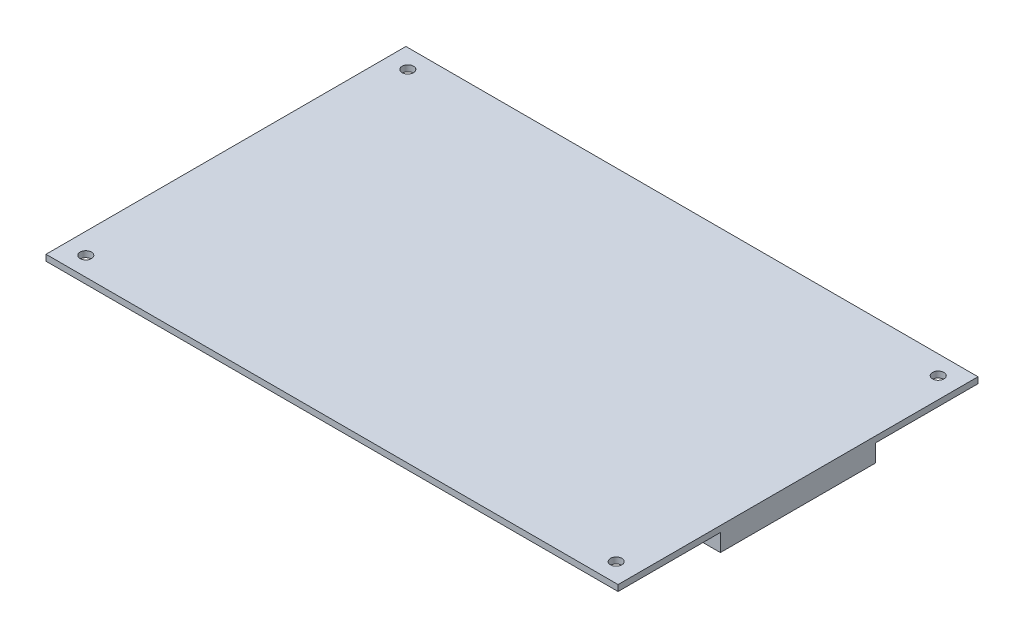
ISO-10303-21;
HEADER;
FILE_DESCRIPTION(('STEP AP214'),'2;1');
FILE_NAME('part.step','',(''),(''),'','','');
FILE_SCHEMA(('AUTOMOTIVE_DESIGN { 1 0 10303 214 1 1 1 1 }'));
ENDSEC;
DATA;
#1=APPLICATION_CONTEXT('core data for automotive mechanical design processes');
#2=APPLICATION_PROTOCOL_DEFINITION('international standard','automotive_design',2000,#1);
#3=PRODUCT_CONTEXT('',#1,'mechanical');
#4=PRODUCT('Part','Part','',(#3));
#5=PRODUCT_RELATED_PRODUCT_CATEGORY('part','',(#4));
#6=PRODUCT_DEFINITION_FORMATION('','',#4);
#7=PRODUCT_DEFINITION_CONTEXT('part definition',#1,'design');
#8=PRODUCT_DEFINITION('design','',#6,#7);
#9=PRODUCT_DEFINITION_SHAPE('','',#8);
#10=(LENGTH_UNIT() NAMED_UNIT(*) SI_UNIT(.MILLI.,.METRE.));
#11=(NAMED_UNIT(*) PLANE_ANGLE_UNIT() SI_UNIT($,.RADIAN.));
#12=(NAMED_UNIT(*) SI_UNIT($,.STERADIAN.) SOLID_ANGLE_UNIT());
#13=UNCERTAINTY_MEASURE_WITH_UNIT(LENGTH_MEASURE(1.E-05),#10,'distance_accuracy_value','');
#14=(GEOMETRIC_REPRESENTATION_CONTEXT(3) GLOBAL_UNCERTAINTY_ASSIGNED_CONTEXT((#13)) GLOBAL_UNIT_ASSIGNED_CONTEXT((#10,
#11,#12)) REPRESENTATION_CONTEXT('',''));
#15=CARTESIAN_POINT('',(0.,0.,0.));
#16=DIRECTION('',(0.,0.,1.));
#17=DIRECTION('',(1.,0.,0.));
#18=AXIS2_PLACEMENT_3D('',#15,#16,#17);
#19=CARTESIAN_POINT('',(0.,0.,0.));
#20=DIRECTION('',(0.,1.,0.));
#21=DIRECTION('',(0.,0.,1.));
#22=AXIS2_PLACEMENT_3D('',#19,#20,#21);
#23=PLANE('',#22);
#24=CARTESIAN_POINT('',(145.5,0.,90.));
#25=DIRECTION('',(0.,1.,0.));
#26=DIRECTION('',(0.,0.,1.));
#27=AXIS2_PLACEMENT_3D('',#24,#25,#26);
#28=CIRCLE('',#27,1.5);
#29=CARTESIAN_POINT('',(145.5,0.,91.5));
#30=VERTEX_POINT('',#29);
#31=EDGE_CURVE('E136',#30,#30,#28,.T.);
#32=ORIENTED_EDGE('',*,*,#31,.T.);
#33=EDGE_LOOP('',(#32));
#34=FACE_BOUND('',#33,.T.);
#35=CARTESIAN_POINT('',(5.49999999999998,0.,90.));
#36=DIRECTION('',(0.,1.,0.));
#37=DIRECTION('',(0.,0.,1.));
#38=AXIS2_PLACEMENT_3D('',#35,#36,#37);
#39=CIRCLE('',#38,1.5);
#40=CARTESIAN_POINT('',(5.49999999999998,0.,91.5));
#41=VERTEX_POINT('',#40);
#42=EDGE_CURVE('E140',#41,#41,#39,.T.);
#43=ORIENTED_EDGE('',*,*,#42,.T.);
#44=EDGE_LOOP('',(#43));
#45=FACE_BOUND('',#44,.T.);
#46=DIRECTION('',(-1.,0.,0.));
#47=VECTOR('',#46,1.);
#48=CARTESIAN_POINT('',(192.257241788564,0.,68.));
#49=LINE('',#48,#47);
#50=CARTESIAN_POINT('',(151.,0.,68.));
#51=VERTEX_POINT('',#50);
#52=CARTESIAN_POINT('',(0.,0.,68.));
#53=VERTEX_POINT('',#52);
#54=EDGE_CURVE('E65',#51,#53,#49,.T.);
#55=ORIENTED_EDGE('',*,*,#54,.F.);
#56=DIRECTION('',(0.,0.,-1.));
#57=VECTOR('',#56,1.);
#58=CARTESIAN_POINT('',(151.,0.,0.));
#59=LINE('',#58,#57);
#60=CARTESIAN_POINT('',(151.,0.,95.));
#61=VERTEX_POINT('',#60);
#62=EDGE_CURVE('E179',#61,#51,#59,.T.);
#63=ORIENTED_EDGE('',*,*,#62,.F.);
#64=DIRECTION('',(1.,0.,0.));
#65=VECTOR('',#64,1.);
#66=CARTESIAN_POINT('',(0.,0.,95.));
#67=LINE('',#66,#65);
#68=CARTESIAN_POINT('',(0.,0.,95.));
#69=VERTEX_POINT('',#68);
#70=EDGE_CURVE('E176',#69,#61,#67,.T.);
#71=ORIENTED_EDGE('',*,*,#70,.F.);
#72=DIRECTION('',(0.,0.,1.));
#73=VECTOR('',#72,1.);
#74=CARTESIAN_POINT('',(0.,0.,0.));
#75=LINE('',#74,#73);
#76=EDGE_CURVE('E158',#53,#69,#75,.T.);
#77=ORIENTED_EDGE('',*,*,#76,.F.);
#78=EDGE_LOOP('',(#55,#63,#71,#77));
#79=FACE_BOUND('',#78,.T.);
#80=ADVANCED_FACE('F39',(#34,#45,#79),#23,.F.);
#81=CARTESIAN_POINT('',(0.,1.6,0.));
#82=DIRECTION('',(1.,0.,0.));
#83=DIRECTION('',(0.,0.,-1.));
#84=AXIS2_PLACEMENT_3D('',#81,#82,#83);
#85=PLANE('',#84);
#86=CARTESIAN_POINT('',(0.,0.,0.));
#87=VERTEX_POINT('',#86);
#88=CARTESIAN_POINT('',(0.,0.,27.));
#89=VERTEX_POINT('',#88);
#90=EDGE_CURVE('E134',#87,#89,#75,.T.);
#91=ORIENTED_EDGE('',*,*,#90,.T.);
#92=DIRECTION('',(0.,-1.,0.));
#93=VECTOR('',#92,1.);
#94=CARTESIAN_POINT('',(0.,0.,27.));
#95=LINE('',#94,#93);
#96=CARTESIAN_POINT('',(0.,-4.6,27.));
#97=VERTEX_POINT('',#96);
#98=EDGE_CURVE('E114',#89,#97,#95,.T.);
#99=ORIENTED_EDGE('',*,*,#98,.T.);
#100=DIRECTION('',(0.,0.,1.));
#101=VECTOR('',#100,1.);
#102=CARTESIAN_POINT('',(0.,-4.6,27.));
#103=LINE('',#102,#101);
#104=CARTESIAN_POINT('',(0.,-4.59999999999999,68.));
#105=VERTEX_POINT('',#104);
#106=EDGE_CURVE('E123',#97,#105,#103,.T.);
#107=ORIENTED_EDGE('',*,*,#106,.T.);
#108=DIRECTION('',(0.,1.,0.));
#109=VECTOR('',#108,1.);
#110=CARTESIAN_POINT('',(0.,0.,68.));
#111=LINE('',#110,#109);
#112=EDGE_CURVE('E120',#105,#53,#111,.T.);
#113=ORIENTED_EDGE('',*,*,#112,.T.);
#114=ORIENTED_EDGE('',*,*,#76,.T.);
#115=DIRECTION('',(0.,-1.,0.));
#116=VECTOR('',#115,1.);
#117=CARTESIAN_POINT('',(0.,1.6,95.));
#118=LINE('',#117,#116);
#119=CARTESIAN_POINT('',(0.,1.6,95.));
#120=VERTEX_POINT('',#119);
#121=EDGE_CURVE('E11',#120,#69,#118,.T.);
#122=ORIENTED_EDGE('',*,*,#121,.F.);
#123=DIRECTION('',(0.,0.,1.));
#124=VECTOR('',#123,1.);
#125=CARTESIAN_POINT('',(0.,1.6,0.));
#126=LINE('',#125,#124);
#127=CARTESIAN_POINT('',(0.,1.6,0.));
#128=VERTEX_POINT('',#127);
#129=EDGE_CURVE('E159',#128,#120,#126,.T.);
#130=ORIENTED_EDGE('',*,*,#129,.F.);
#131=DIRECTION('',(0.,-1.,0.));
#132=VECTOR('',#131,1.);
#133=CARTESIAN_POINT('',(0.,1.6,0.));
#134=LINE('',#133,#132);
#135=EDGE_CURVE('E173',#128,#87,#134,.T.);
#136=ORIENTED_EDGE('',*,*,#135,.T.);
#137=EDGE_LOOP('',(#91,#99,#107,#113,#114,#122,#130,#136));
#138=FACE_BOUND('',#137,.T.);
#139=ADVANCED_FACE('F41',(#138),#85,.F.);
#140=CARTESIAN_POINT('',(0.,1.6,95.));
#141=DIRECTION('',(0.,0.,-1.));
#142=DIRECTION('',(-1.,0.,0.));
#143=AXIS2_PLACEMENT_3D('',#140,#141,#142);
#144=PLANE('',#143);
#145=ORIENTED_EDGE('',*,*,#70,.T.);
#146=DIRECTION('',(0.,-1.,0.));
#147=VECTOR('',#146,1.);
#148=CARTESIAN_POINT('',(151.,1.6,95.));
#149=LINE('',#148,#147);
#150=CARTESIAN_POINT('',(151.,1.6,95.));
#151=VERTEX_POINT('',#150);
#152=EDGE_CURVE('E49',#151,#61,#149,.T.);
#153=ORIENTED_EDGE('',*,*,#152,.F.);
#154=DIRECTION('',(1.,0.,0.));
#155=VECTOR('',#154,1.);
#156=CARTESIAN_POINT('',(0.,1.6,95.));
#157=LINE('',#156,#155);
#158=EDGE_CURVE('E163',#120,#151,#157,.T.);
#159=ORIENTED_EDGE('',*,*,#158,.F.);
#160=ORIENTED_EDGE('',*,*,#121,.T.);
#161=EDGE_LOOP('',(#145,#153,#159,#160));
#162=FACE_BOUND('',#161,.T.);
#163=ADVANCED_FACE('F235',(#162),#144,.F.);
#164=CARTESIAN_POINT('',(151.,1.6,0.));
#165=DIRECTION('',(-1.,0.,0.));
#166=DIRECTION('',(0.,0.,1.));
#167=AXIS2_PLACEMENT_3D('',#164,#165,#166);
#168=PLANE('',#167);
#169=ORIENTED_EDGE('',*,*,#62,.T.);
#170=DIRECTION('',(0.,-1.,0.));
#171=VECTOR('',#170,1.);
#172=CARTESIAN_POINT('',(151.,0.,68.));
#173=LINE('',#172,#171);
#174=CARTESIAN_POINT('',(151.,-4.59999999999999,68.));
#175=VERTEX_POINT('',#174);
#176=EDGE_CURVE('E150',#51,#175,#173,.T.);
#177=ORIENTED_EDGE('',*,*,#176,.T.);
#178=DIRECTION('',(0.,0.,-1.));
#179=VECTOR('',#178,1.);
#180=CARTESIAN_POINT('',(151.,-4.6,27.));
#181=LINE('',#180,#179);
#182=CARTESIAN_POINT('',(151.,-4.6,27.));
#183=VERTEX_POINT('',#182);
#184=EDGE_CURVE('E155',#175,#183,#181,.T.);
#185=ORIENTED_EDGE('',*,*,#184,.T.);
#186=DIRECTION('',(0.,1.,0.));
#187=VECTOR('',#186,1.);
#188=CARTESIAN_POINT('',(151.,0.,27.));
#189=LINE('',#188,#187);
#190=CARTESIAN_POINT('',(151.,0.,27.));
#191=VERTEX_POINT('',#190);
#192=EDGE_CURVE('E115',#183,#191,#189,.T.);
#193=ORIENTED_EDGE('',*,*,#192,.T.);
#194=CARTESIAN_POINT('',(151.,0.,0.));
#195=VERTEX_POINT('',#194);
#196=EDGE_CURVE('E57',#191,#195,#59,.T.);
#197=ORIENTED_EDGE('',*,*,#196,.T.);
#198=DIRECTION('',(0.,-1.,0.));
#199=VECTOR('',#198,1.);
#200=CARTESIAN_POINT('',(151.,1.6,0.));
#201=LINE('',#200,#199);
#202=CARTESIAN_POINT('',(151.,1.6,0.));
#203=VERTEX_POINT('',#202);
#204=EDGE_CURVE('E186',#203,#195,#201,.T.);
#205=ORIENTED_EDGE('',*,*,#204,.F.);
#206=DIRECTION('',(0.,0.,-1.));
#207=VECTOR('',#206,1.);
#208=CARTESIAN_POINT('',(151.,1.6,0.));
#209=LINE('',#208,#207);
#210=EDGE_CURVE('E167',#151,#203,#209,.T.);
#211=ORIENTED_EDGE('',*,*,#210,.F.);
#212=ORIENTED_EDGE('',*,*,#152,.T.);
#213=EDGE_LOOP('',(#169,#177,#185,#193,#197,#205,#211,#212));
#214=FACE_BOUND('',#213,.T.);
#215=ADVANCED_FACE('F220',(#214),#168,.F.);
#216=CARTESIAN_POINT('',(0.,1.6,0.));
#217=DIRECTION('',(0.,0.,1.));
#218=DIRECTION('',(1.,0.,0.));
#219=AXIS2_PLACEMENT_3D('',#216,#217,#218);
#220=PLANE('',#219);
#221=DIRECTION('',(-1.,0.,0.));
#222=VECTOR('',#221,1.);
#223=CARTESIAN_POINT('',(0.,0.,0.));
#224=LINE('',#223,#222);
#225=EDGE_CURVE('E164',#195,#87,#224,.T.);
#226=ORIENTED_EDGE('',*,*,#225,.T.);
#227=ORIENTED_EDGE('',*,*,#135,.F.);
#228=DIRECTION('',(-1.,0.,0.));
#229=VECTOR('',#228,1.);
#230=CARTESIAN_POINT('',(0.,1.6,0.));
#231=LINE('',#230,#229);
#232=EDGE_CURVE('E170',#203,#128,#231,.T.);
#233=ORIENTED_EDGE('',*,*,#232,.F.);
#234=ORIENTED_EDGE('',*,*,#204,.T.);
#235=EDGE_LOOP('',(#226,#227,#233,#234));
#236=FACE_BOUND('',#235,.T.);
#237=ADVANCED_FACE('F225',(#236),#220,.F.);
#238=CARTESIAN_POINT('',(0.,1.6,0.));
#239=DIRECTION('',(0.,1.,0.));
#240=DIRECTION('',(0.,0.,1.));
#241=AXIS2_PLACEMENT_3D('',#238,#239,#240);
#242=PLANE('',#241);
#243=CARTESIAN_POINT('',(145.5,1.6,4.99999999999998));
#244=DIRECTION('',(0.,1.,0.));
#245=DIRECTION('',(0.,0.,-1.));
#246=AXIS2_PLACEMENT_3D('',#243,#244,#245);
#247=CIRCLE('',#246,1.5);
#248=CARTESIAN_POINT('',(145.5,1.6,6.49999999999998));
#249=VERTEX_POINT('',#248);
#250=EDGE_CURVE('E212',#249,#249,#247,.T.);
#251=ORIENTED_EDGE('',*,*,#250,.F.);
#252=EDGE_LOOP('',(#251));
#253=FACE_BOUND('',#252,.T.);
#254=CARTESIAN_POINT('',(145.5,1.6,90.));
#255=DIRECTION('',(0.,1.,0.));
#256=DIRECTION('',(0.,0.,1.));
#257=AXIS2_PLACEMENT_3D('',#254,#255,#256);
#258=CIRCLE('',#257,1.5);
#259=CARTESIAN_POINT('',(145.5,1.6,91.5));
#260=VERTEX_POINT('',#259);
#261=EDGE_CURVE('E208',#260,#260,#258,.T.);
#262=ORIENTED_EDGE('',*,*,#261,.F.);
#263=EDGE_LOOP('',(#262));
#264=FACE_BOUND('',#263,.T.);
#265=CARTESIAN_POINT('',(5.49999999999998,1.6,90.));
#266=DIRECTION('',(0.,1.,0.));
#267=DIRECTION('',(0.,0.,-1.));
#268=AXIS2_PLACEMENT_3D('',#265,#266,#267);
#269=CIRCLE('',#268,1.5);
#270=CARTESIAN_POINT('',(5.49999999999998,1.6,91.5));
#271=VERTEX_POINT('',#270);
#272=EDGE_CURVE('E202',#271,#271,#269,.T.);
#273=ORIENTED_EDGE('',*,*,#272,.F.);
#274=EDGE_LOOP('',(#273));
#275=FACE_BOUND('',#274,.T.);
#276=CARTESIAN_POINT('',(5.49999999999997,1.6,5.));
#277=DIRECTION('',(0.,1.,0.));
#278=DIRECTION('',(0.,0.,1.));
#279=AXIS2_PLACEMENT_3D('',#276,#277,#278);
#280=CIRCLE('',#279,1.5);
#281=CARTESIAN_POINT('',(5.49999999999997,1.6,6.5));
#282=VERTEX_POINT('',#281);
#283=EDGE_CURVE('E195',#282,#282,#280,.T.);
#284=ORIENTED_EDGE('',*,*,#283,.F.);
#285=EDGE_LOOP('',(#284));
#286=FACE_BOUND('',#285,.T.);
#287=ORIENTED_EDGE('',*,*,#129,.T.);
#288=ORIENTED_EDGE('',*,*,#158,.T.);
#289=ORIENTED_EDGE('',*,*,#210,.T.);
#290=ORIENTED_EDGE('',*,*,#232,.T.);
#291=EDGE_LOOP('',(#287,#288,#289,#290));
#292=FACE_BOUND('',#291,.T.);
#293=ADVANCED_FACE('F230',(#253,#264,#275,#286,#292),#242,.T.);
#294=CARTESIAN_POINT('',(145.5,0.,4.99999999999998));
#295=DIRECTION('',(0.,1.,0.));
#296=DIRECTION('',(0.,0.,1.));
#297=AXIS2_PLACEMENT_3D('',#294,#295,#296);
#298=CIRCLE('',#297,1.5);
#299=CARTESIAN_POINT('',(145.5,0.,6.49999999999998));
#300=VERTEX_POINT('',#299);
#301=EDGE_CURVE('E43',#300,#300,#298,.T.);
#302=ORIENTED_EDGE('',*,*,#301,.T.);
#303=EDGE_LOOP('',(#302));
#304=FACE_BOUND('',#303,.T.);
#305=CARTESIAN_POINT('',(5.49999999999997,0.,5.));
#306=DIRECTION('',(0.,1.,0.));
#307=DIRECTION('',(0.,0.,1.));
#308=AXIS2_PLACEMENT_3D('',#305,#306,#307);
#309=CIRCLE('',#308,1.5);
#310=CARTESIAN_POINT('',(5.49999999999997,0.,6.5));
#311=VERTEX_POINT('',#310);
#312=EDGE_CURVE('E192',#311,#311,#309,.T.);
#313=ORIENTED_EDGE('',*,*,#312,.T.);
#314=EDGE_LOOP('',(#313));
#315=FACE_BOUND('',#314,.T.);
#316=ORIENTED_EDGE('',*,*,#196,.F.);
#317=DIRECTION('',(-1.,0.,0.));
#318=VECTOR('',#317,1.);
#319=CARTESIAN_POINT('',(192.257241788564,0.,27.));
#320=LINE('',#319,#318);
#321=EDGE_CURVE('E147',#191,#89,#320,.T.);
#322=ORIENTED_EDGE('',*,*,#321,.T.);
#323=ORIENTED_EDGE('',*,*,#90,.F.);
#324=ORIENTED_EDGE('',*,*,#225,.F.);
#325=EDGE_LOOP('',(#316,#322,#323,#324));
#326=FACE_BOUND('',#325,.T.);
#327=ADVANCED_FACE('F222',(#304,#315,#326),#23,.F.);
#328=CARTESIAN_POINT('',(192.257241788564,0.,27.));
#329=DIRECTION('',(0.,0.,-1.));
#330=DIRECTION('',(-1.,0.,0.));
#331=AXIS2_PLACEMENT_3D('',#328,#329,#330);
#332=PLANE('',#331);
#333=ORIENTED_EDGE('',*,*,#192,.F.);
#334=DIRECTION('',(-1.,0.,0.));
#335=VECTOR('',#334,1.);
#336=CARTESIAN_POINT('',(192.257241788564,-4.6,27.));
#337=LINE('',#336,#335);
#338=EDGE_CURVE('E109',#183,#97,#337,.T.);
#339=ORIENTED_EDGE('',*,*,#338,.T.);
#340=ORIENTED_EDGE('',*,*,#98,.F.);
#341=ORIENTED_EDGE('',*,*,#321,.F.);
#342=EDGE_LOOP('',(#333,#339,#340,#341));
#343=FACE_BOUND('',#342,.T.);
#344=ADVANCED_FACE('F111',(#343),#332,.T.);
#345=CARTESIAN_POINT('',(192.257241788564,0.,68.));
#346=DIRECTION('',(0.,0.,1.));
#347=DIRECTION('',(0.,-1.,0.));
#348=AXIS2_PLACEMENT_3D('',#345,#346,#347);
#349=PLANE('',#348);
#350=ORIENTED_EDGE('',*,*,#176,.F.);
#351=ORIENTED_EDGE('',*,*,#54,.T.);
#352=ORIENTED_EDGE('',*,*,#112,.F.);
#353=DIRECTION('',(-1.,0.,0.));
#354=VECTOR('',#353,1.);
#355=CARTESIAN_POINT('',(192.257241788564,-4.59999999999999,68.));
#356=LINE('',#355,#354);
#357=EDGE_CURVE('E119',#175,#105,#356,.T.);
#358=ORIENTED_EDGE('',*,*,#357,.F.);
#359=EDGE_LOOP('',(#350,#351,#352,#358));
#360=FACE_BOUND('',#359,.T.);
#361=ADVANCED_FACE('F256',(#360),#349,.T.);
#362=CARTESIAN_POINT('',(192.257241788564,-4.6,27.));
#363=DIRECTION('',(0.,-1.,0.));
#364=DIRECTION('',(0.,0.,-1.));
#365=AXIS2_PLACEMENT_3D('',#362,#363,#364);
#366=PLANE('',#365);
#367=ORIENTED_EDGE('',*,*,#184,.F.);
#368=ORIENTED_EDGE('',*,*,#357,.T.);
#369=ORIENTED_EDGE('',*,*,#106,.F.);
#370=ORIENTED_EDGE('',*,*,#338,.F.);
#371=EDGE_LOOP('',(#367,#368,#369,#370));
#372=FACE_BOUND('',#371,.T.);
#373=ADVANCED_FACE('F124',(#372),#366,.T.);
#374=CARTESIAN_POINT('',(5.49999999999997,-4.6,5.));
#375=DIRECTION('',(0.,1.,0.));
#376=DIRECTION('',(0.,0.,1.));
#377=AXIS2_PLACEMENT_3D('',#374,#375,#376);
#378=CYLINDRICAL_SURFACE('',#377,1.5);
#379=CARTESIAN_POINT('',(5.49999999999997,1.6,6.5));
#380=CARTESIAN_POINT('',(5.49999999999997,1.58333333333333,6.5));
#381=CARTESIAN_POINT('',(5.49999999999997,1.56666666666667,6.5));
#382=CARTESIAN_POINT('',(5.49999999999997,1.53333333333333,6.5));
#383=CARTESIAN_POINT('',(5.49999999999997,1.51666666666667,6.5));
#384=CARTESIAN_POINT('',(5.49999999999997,1.48333333333333,6.5));
#385=CARTESIAN_POINT('',(5.49999999999997,1.46666666666667,6.5));
#386=CARTESIAN_POINT('',(5.49999999999997,1.43333333333333,6.5));
#387=CARTESIAN_POINT('',(5.49999999999997,1.41666666666667,6.5));
#388=CARTESIAN_POINT('',(5.49999999999997,1.38333333333333,6.5));
#389=CARTESIAN_POINT('',(5.49999999999997,1.36666666666667,6.5));
#390=CARTESIAN_POINT('',(5.49999999999997,1.33333333333333,6.5));
#391=CARTESIAN_POINT('',(5.49999999999997,1.31666666666667,6.5));
#392=CARTESIAN_POINT('',(5.49999999999997,1.28333333333333,6.5));
#393=CARTESIAN_POINT('',(5.49999999999997,1.26666666666667,6.5));
#394=CARTESIAN_POINT('',(5.49999999999997,1.23333333333333,6.5));
#395=CARTESIAN_POINT('',(5.49999999999997,1.21666666666667,6.5));
#396=CARTESIAN_POINT('',(5.49999999999997,1.18333333333333,6.5));
#397=CARTESIAN_POINT('',(5.49999999999997,1.16666666666667,6.5));
#398=CARTESIAN_POINT('',(5.49999999999997,1.13333333333333,6.5));
#399=CARTESIAN_POINT('',(5.49999999999997,1.11666666666667,6.5));
#400=CARTESIAN_POINT('',(5.49999999999997,1.08333333333333,6.5));
#401=CARTESIAN_POINT('',(5.49999999999997,1.06666666666667,6.5));
#402=CARTESIAN_POINT('',(5.49999999999997,1.03333333333333,6.5));
#403=CARTESIAN_POINT('',(5.49999999999997,1.01666666666667,6.5));
#404=CARTESIAN_POINT('',(5.49999999999997,0.983333333333333,6.5));
#405=CARTESIAN_POINT('',(5.49999999999997,0.966666666666666,6.5));
#406=CARTESIAN_POINT('',(5.49999999999997,0.933333333333333,6.5));
#407=CARTESIAN_POINT('',(5.49999999999997,0.916666666666666,6.5));
#408=CARTESIAN_POINT('',(5.49999999999997,0.883333333333333,6.5));
#409=CARTESIAN_POINT('',(5.49999999999997,0.866666666666666,6.5));
#410=CARTESIAN_POINT('',(5.49999999999997,0.833333333333333,6.5));
#411=CARTESIAN_POINT('',(5.49999999999997,0.816666666666666,6.5));
#412=CARTESIAN_POINT('',(5.49999999999997,0.783333333333333,6.5));
#413=CARTESIAN_POINT('',(5.49999999999997,0.766666666666666,6.5));
#414=CARTESIAN_POINT('',(5.49999999999997,0.733333333333333,6.5));
#415=CARTESIAN_POINT('',(5.49999999999997,0.716666666666666,6.5));
#416=CARTESIAN_POINT('',(5.49999999999997,0.683333333333333,6.5));
#417=CARTESIAN_POINT('',(5.49999999999997,0.666666666666666,6.5));
#418=CARTESIAN_POINT('',(5.49999999999997,0.633333333333333,6.5));
#419=CARTESIAN_POINT('',(5.49999999999997,0.616666666666666,6.5));
#420=CARTESIAN_POINT('',(5.49999999999997,0.583333333333332,6.5));
#421=CARTESIAN_POINT('',(5.49999999999997,0.566666666666666,6.5));
#422=CARTESIAN_POINT('',(5.49999999999997,0.533333333333333,6.5));
#423=CARTESIAN_POINT('',(5.49999999999997,0.516666666666666,6.5));
#424=CARTESIAN_POINT('',(5.49999999999997,0.483333333333333,6.5));
#425=CARTESIAN_POINT('',(5.49999999999997,0.466666666666666,6.5));
#426=CARTESIAN_POINT('',(5.49999999999997,0.433333333333333,6.5));
#427=CARTESIAN_POINT('',(5.49999999999997,0.416666666666666,6.5));
#428=CARTESIAN_POINT('',(5.49999999999997,0.383333333333332,6.5));
#429=CARTESIAN_POINT('',(5.49999999999997,0.366666666666666,6.5));
#430=CARTESIAN_POINT('',(5.49999999999997,0.333333333333332,6.5));
#431=CARTESIAN_POINT('',(5.49999999999997,0.316666666666666,6.5));
#432=CARTESIAN_POINT('',(5.49999999999997,0.283333333333332,6.5));
#433=CARTESIAN_POINT('',(5.49999999999997,0.266666666666666,6.5));
#434=CARTESIAN_POINT('',(5.49999999999997,0.233333333333333,6.5));
#435=CARTESIAN_POINT('',(5.49999999999997,0.216666666666666,6.5));
#436=CARTESIAN_POINT('',(5.49999999999997,0.183333333333333,6.5));
#437=CARTESIAN_POINT('',(5.49999999999997,0.166666666666666,6.5));
#438=CARTESIAN_POINT('',(5.49999999999997,0.133333333333333,6.5));
#439=CARTESIAN_POINT('',(5.49999999999997,0.116666666666666,6.5));
#440=CARTESIAN_POINT('',(5.49999999999997,0.0833333333333325,6.5));
#441=CARTESIAN_POINT('',(5.49999999999997,0.0666666666666657,6.5));
#442=CARTESIAN_POINT('',(5.49999999999997,0.0333333333333323,6.5));
#443=CARTESIAN_POINT('',(5.49999999999997,0.0166666666666657,6.5));
#444=CARTESIAN_POINT('',(5.49999999999997,0.,6.5));
#445=B_SPLINE_CURVE_WITH_KNOTS('',3,(#379,#380,#381,#382,#383,#384,#385,#386,#387,#388,#389,
#390,#391,#392,#393,#394,#395,#396,#397,#398,#399,#400,#401,#402,#403,#404,#405,#406,#407,#408,
#409,#410,#411,#412,#413,#414,#415,#416,#417,#418,#419,#420,#421,#422,#423,#424,#425,#426,#427,
#428,#429,#430,#431,#432,#433,#434,#435,#436,#437,#438,#439,#440,#441,#442,#443,#444),
.UNSPECIFIED.,.F.,.F.,(4,2,2,2,2,2,2,2,2,2,2,2,2,2,2,2,2,2,2,2,2,2,2,2,2,2,2,2,2,2,2,2,4),(0.,
0.0499999999999997,0.1,0.15,0.200000000000001,0.25,0.3,0.35,0.4,0.45,0.5,0.55,0.6,0.65,0.7,
0.750000000000001,0.8,0.85,0.900000000000001,0.95,1.,1.05,1.1,1.15,1.2,1.25,1.3,1.35,1.4,1.45,
1.5,1.55,1.6),.UNSPECIFIED.);
#446=EDGE_CURVE('BSEAM264',#282,#311,#445,.T.);
#447=ORIENTED_EDGE('',*,*,#283,.T.);
#448=ORIENTED_EDGE('',*,*,#312,.F.);
#449=ORIENTED_EDGE('',*,*,#446,.T.);
#450=ORIENTED_EDGE('',*,*,#446,.F.);
#451=EDGE_LOOP('',(#447,#449,#448,#450));
#452=FACE_BOUND('',#451,.T.);
#453=ADVANCED_FACE('F264',(#452),#378,.F.);
#454=CARTESIAN_POINT('',(145.5,-4.6,4.99999999999998));
#455=DIRECTION('',(0.,1.,0.));
#456=DIRECTION('',(0.,0.,1.));
#457=AXIS2_PLACEMENT_3D('',#454,#455,#456);
#458=CYLINDRICAL_SURFACE('',#457,1.5);
#459=CARTESIAN_POINT('',(145.5,1.6,6.49999999999998));
#460=CARTESIAN_POINT('',(145.5,1.58333333333333,6.49999999999998));
#461=CARTESIAN_POINT('',(145.5,1.56666666666667,6.49999999999998));
#462=CARTESIAN_POINT('',(145.5,1.53333333333333,6.49999999999998));
#463=CARTESIAN_POINT('',(145.5,1.51666666666667,6.49999999999998));
#464=CARTESIAN_POINT('',(145.5,1.48333333333333,6.49999999999998));
#465=CARTESIAN_POINT('',(145.5,1.46666666666667,6.49999999999998));
#466=CARTESIAN_POINT('',(145.5,1.43333333333333,6.49999999999998));
#467=CARTESIAN_POINT('',(145.5,1.41666666666667,6.49999999999998));
#468=CARTESIAN_POINT('',(145.5,1.38333333333333,6.49999999999998));
#469=CARTESIAN_POINT('',(145.5,1.36666666666667,6.49999999999998));
#470=CARTESIAN_POINT('',(145.5,1.33333333333333,6.49999999999998));
#471=CARTESIAN_POINT('',(145.5,1.31666666666667,6.49999999999998));
#472=CARTESIAN_POINT('',(145.5,1.28333333333333,6.49999999999998));
#473=CARTESIAN_POINT('',(145.5,1.26666666666667,6.49999999999998));
#474=CARTESIAN_POINT('',(145.5,1.23333333333333,6.49999999999998));
#475=CARTESIAN_POINT('',(145.5,1.21666666666667,6.49999999999998));
#476=CARTESIAN_POINT('',(145.5,1.18333333333333,6.49999999999998));
#477=CARTESIAN_POINT('',(145.5,1.16666666666667,6.49999999999998));
#478=CARTESIAN_POINT('',(145.5,1.13333333333333,6.49999999999998));
#479=CARTESIAN_POINT('',(145.5,1.11666666666667,6.49999999999998));
#480=CARTESIAN_POINT('',(145.5,1.08333333333333,6.49999999999998));
#481=CARTESIAN_POINT('',(145.5,1.06666666666667,6.49999999999998));
#482=CARTESIAN_POINT('',(145.5,1.03333333333333,6.49999999999998));
#483=CARTESIAN_POINT('',(145.5,1.01666666666667,6.49999999999998));
#484=CARTESIAN_POINT('',(145.5,0.983333333333333,6.49999999999998));
#485=CARTESIAN_POINT('',(145.5,0.966666666666666,6.49999999999998));
#486=CARTESIAN_POINT('',(145.5,0.933333333333333,6.49999999999998));
#487=CARTESIAN_POINT('',(145.5,0.916666666666666,6.49999999999998));
#488=CARTESIAN_POINT('',(145.5,0.883333333333333,6.49999999999998));
#489=CARTESIAN_POINT('',(145.5,0.866666666666666,6.49999999999998));
#490=CARTESIAN_POINT('',(145.5,0.833333333333333,6.49999999999998));
#491=CARTESIAN_POINT('',(145.5,0.816666666666666,6.49999999999998));
#492=CARTESIAN_POINT('',(145.5,0.783333333333333,6.49999999999998));
#493=CARTESIAN_POINT('',(145.5,0.766666666666666,6.49999999999998));
#494=CARTESIAN_POINT('',(145.5,0.733333333333333,6.49999999999998));
#495=CARTESIAN_POINT('',(145.5,0.716666666666666,6.49999999999998));
#496=CARTESIAN_POINT('',(145.5,0.683333333333333,6.49999999999998));
#497=CARTESIAN_POINT('',(145.5,0.666666666666666,6.49999999999998));
#498=CARTESIAN_POINT('',(145.5,0.633333333333333,6.49999999999998));
#499=CARTESIAN_POINT('',(145.5,0.616666666666666,6.49999999999998));
#500=CARTESIAN_POINT('',(145.5,0.583333333333332,6.49999999999998));
#501=CARTESIAN_POINT('',(145.5,0.566666666666666,6.49999999999998));
#502=CARTESIAN_POINT('',(145.5,0.533333333333333,6.49999999999998));
#503=CARTESIAN_POINT('',(145.5,0.516666666666666,6.49999999999998));
#504=CARTESIAN_POINT('',(145.5,0.483333333333333,6.49999999999998));
#505=CARTESIAN_POINT('',(145.5,0.466666666666666,6.49999999999998));
#506=CARTESIAN_POINT('',(145.5,0.433333333333333,6.49999999999998));
#507=CARTESIAN_POINT('',(145.5,0.416666666666666,6.49999999999998));
#508=CARTESIAN_POINT('',(145.5,0.383333333333332,6.49999999999998));
#509=CARTESIAN_POINT('',(145.5,0.366666666666666,6.49999999999998));
#510=CARTESIAN_POINT('',(145.5,0.333333333333332,6.49999999999998));
#511=CARTESIAN_POINT('',(145.5,0.316666666666666,6.49999999999998));
#512=CARTESIAN_POINT('',(145.5,0.283333333333332,6.49999999999998));
#513=CARTESIAN_POINT('',(145.5,0.266666666666666,6.49999999999998));
#514=CARTESIAN_POINT('',(145.5,0.233333333333333,6.49999999999998));
#515=CARTESIAN_POINT('',(145.5,0.216666666666666,6.49999999999998));
#516=CARTESIAN_POINT('',(145.5,0.183333333333333,6.49999999999998));
#517=CARTESIAN_POINT('',(145.5,0.166666666666666,6.49999999999998));
#518=CARTESIAN_POINT('',(145.5,0.133333333333333,6.49999999999998));
#519=CARTESIAN_POINT('',(145.5,0.116666666666666,6.49999999999998));
#520=CARTESIAN_POINT('',(145.5,0.0833333333333325,6.49999999999998));
#521=CARTESIAN_POINT('',(145.5,0.0666666666666657,6.49999999999998));
#522=CARTESIAN_POINT('',(145.5,0.0333333333333323,6.49999999999998));
#523=CARTESIAN_POINT('',(145.5,0.0166666666666657,6.49999999999998));
#524=CARTESIAN_POINT('',(145.5,0.,6.49999999999998));
#525=B_SPLINE_CURVE_WITH_KNOTS('',3,(#459,#460,#461,#462,#463,#464,#465,#466,#467,#468,#469,
#470,#471,#472,#473,#474,#475,#476,#477,#478,#479,#480,#481,#482,#483,#484,#485,#486,#487,#488,
#489,#490,#491,#492,#493,#494,#495,#496,#497,#498,#499,#500,#501,#502,#503,#504,#505,#506,#507,
#508,#509,#510,#511,#512,#513,#514,#515,#516,#517,#518,#519,#520,#521,#522,#523,#524),
.UNSPECIFIED.,.F.,.F.,(4,2,2,2,2,2,2,2,2,2,2,2,2,2,2,2,2,2,2,2,2,2,2,2,2,2,2,2,2,2,2,2,4),(0.,
0.0499999999999997,0.1,0.15,0.200000000000001,0.25,0.3,0.35,0.4,0.45,0.5,0.55,0.6,0.65,0.7,
0.750000000000001,0.8,0.85,0.900000000000001,0.95,1.,1.05,1.1,1.15,1.2,1.25,1.3,1.35,1.4,1.45,
1.5,1.55,1.6),.UNSPECIFIED.);
#526=EDGE_CURVE('BSEAM261',#249,#300,#525,.T.);
#527=ORIENTED_EDGE('',*,*,#250,.T.);
#528=ORIENTED_EDGE('',*,*,#301,.F.);
#529=ORIENTED_EDGE('',*,*,#526,.T.);
#530=ORIENTED_EDGE('',*,*,#526,.F.);
#531=EDGE_LOOP('',(#527,#529,#528,#530));
#532=FACE_BOUND('',#531,.T.);
#533=ADVANCED_FACE('F261',(#532),#458,.F.);
#534=CARTESIAN_POINT('',(5.49999999999998,-4.6,90.));
#535=DIRECTION('',(0.,1.,0.));
#536=DIRECTION('',(0.,0.,1.));
#537=AXIS2_PLACEMENT_3D('',#534,#535,#536);
#538=CYLINDRICAL_SURFACE('',#537,1.5);
#539=CARTESIAN_POINT('',(5.49999999999998,1.6,91.5));
#540=CARTESIAN_POINT('',(5.49999999999998,1.58333333333333,91.5));
#541=CARTESIAN_POINT('',(5.49999999999998,1.56666666666667,91.5));
#542=CARTESIAN_POINT('',(5.49999999999998,1.53333333333333,91.5));
#543=CARTESIAN_POINT('',(5.49999999999998,1.51666666666667,91.5));
#544=CARTESIAN_POINT('',(5.49999999999998,1.48333333333333,91.5));
#545=CARTESIAN_POINT('',(5.49999999999998,1.46666666666667,91.5));
#546=CARTESIAN_POINT('',(5.49999999999998,1.43333333333333,91.5));
#547=CARTESIAN_POINT('',(5.49999999999998,1.41666666666667,91.5));
#548=CARTESIAN_POINT('',(5.49999999999998,1.38333333333333,91.5));
#549=CARTESIAN_POINT('',(5.49999999999998,1.36666666666667,91.5));
#550=CARTESIAN_POINT('',(5.49999999999998,1.33333333333333,91.5));
#551=CARTESIAN_POINT('',(5.49999999999998,1.31666666666667,91.5));
#552=CARTESIAN_POINT('',(5.49999999999998,1.28333333333333,91.5));
#553=CARTESIAN_POINT('',(5.49999999999998,1.26666666666667,91.5));
#554=CARTESIAN_POINT('',(5.49999999999998,1.23333333333333,91.5));
#555=CARTESIAN_POINT('',(5.49999999999998,1.21666666666667,91.5));
#556=CARTESIAN_POINT('',(5.49999999999998,1.18333333333333,91.5));
#557=CARTESIAN_POINT('',(5.49999999999998,1.16666666666667,91.5));
#558=CARTESIAN_POINT('',(5.49999999999998,1.13333333333333,91.5));
#559=CARTESIAN_POINT('',(5.49999999999998,1.11666666666667,91.5));
#560=CARTESIAN_POINT('',(5.49999999999998,1.08333333333333,91.5));
#561=CARTESIAN_POINT('',(5.49999999999998,1.06666666666667,91.5));
#562=CARTESIAN_POINT('',(5.49999999999998,1.03333333333333,91.5));
#563=CARTESIAN_POINT('',(5.49999999999998,1.01666666666667,91.5));
#564=CARTESIAN_POINT('',(5.49999999999998,0.983333333333333,91.5));
#565=CARTESIAN_POINT('',(5.49999999999998,0.966666666666666,91.5));
#566=CARTESIAN_POINT('',(5.49999999999998,0.933333333333333,91.5));
#567=CARTESIAN_POINT('',(5.49999999999998,0.916666666666666,91.5));
#568=CARTESIAN_POINT('',(5.49999999999998,0.883333333333333,91.5));
#569=CARTESIAN_POINT('',(5.49999999999998,0.866666666666666,91.5));
#570=CARTESIAN_POINT('',(5.49999999999998,0.833333333333333,91.5));
#571=CARTESIAN_POINT('',(5.49999999999998,0.816666666666666,91.5));
#572=CARTESIAN_POINT('',(5.49999999999998,0.783333333333333,91.5));
#573=CARTESIAN_POINT('',(5.49999999999998,0.766666666666666,91.5));
#574=CARTESIAN_POINT('',(5.49999999999998,0.733333333333333,91.5));
#575=CARTESIAN_POINT('',(5.49999999999998,0.716666666666666,91.5));
#576=CARTESIAN_POINT('',(5.49999999999998,0.683333333333333,91.5));
#577=CARTESIAN_POINT('',(5.49999999999998,0.666666666666666,91.5));
#578=CARTESIAN_POINT('',(5.49999999999998,0.633333333333333,91.5));
#579=CARTESIAN_POINT('',(5.49999999999998,0.616666666666666,91.5));
#580=CARTESIAN_POINT('',(5.49999999999998,0.583333333333332,91.5));
#581=CARTESIAN_POINT('',(5.49999999999998,0.566666666666666,91.5));
#582=CARTESIAN_POINT('',(5.49999999999998,0.533333333333333,91.5));
#583=CARTESIAN_POINT('',(5.49999999999998,0.516666666666666,91.5));
#584=CARTESIAN_POINT('',(5.49999999999998,0.483333333333333,91.5));
#585=CARTESIAN_POINT('',(5.49999999999998,0.466666666666666,91.5));
#586=CARTESIAN_POINT('',(5.49999999999998,0.433333333333333,91.5));
#587=CARTESIAN_POINT('',(5.49999999999998,0.416666666666666,91.5));
#588=CARTESIAN_POINT('',(5.49999999999998,0.383333333333332,91.5));
#589=CARTESIAN_POINT('',(5.49999999999998,0.366666666666666,91.5));
#590=CARTESIAN_POINT('',(5.49999999999998,0.333333333333332,91.5));
#591=CARTESIAN_POINT('',(5.49999999999998,0.316666666666666,91.5));
#592=CARTESIAN_POINT('',(5.49999999999998,0.283333333333332,91.5));
#593=CARTESIAN_POINT('',(5.49999999999998,0.266666666666666,91.5));
#594=CARTESIAN_POINT('',(5.49999999999998,0.233333333333333,91.5));
#595=CARTESIAN_POINT('',(5.49999999999998,0.216666666666666,91.5));
#596=CARTESIAN_POINT('',(5.49999999999998,0.183333333333333,91.5));
#597=CARTESIAN_POINT('',(5.49999999999998,0.166666666666666,91.5));
#598=CARTESIAN_POINT('',(5.49999999999998,0.133333333333333,91.5));
#599=CARTESIAN_POINT('',(5.49999999999998,0.116666666666666,91.5));
#600=CARTESIAN_POINT('',(5.49999999999998,0.0833333333333325,91.5));
#601=CARTESIAN_POINT('',(5.49999999999998,0.0666666666666657,91.5));
#602=CARTESIAN_POINT('',(5.49999999999998,0.0333333333333323,91.5));
#603=CARTESIAN_POINT('',(5.49999999999998,0.0166666666666657,91.5));
#604=CARTESIAN_POINT('',(5.49999999999998,0.,91.5));
#605=B_SPLINE_CURVE_WITH_KNOTS('',3,(#539,#540,#541,#542,#543,#544,#545,#546,#547,#548,#549,
#550,#551,#552,#553,#554,#555,#556,#557,#558,#559,#560,#561,#562,#563,#564,#565,#566,#567,#568,
#569,#570,#571,#572,#573,#574,#575,#576,#577,#578,#579,#580,#581,#582,#583,#584,#585,#586,#587,
#588,#589,#590,#591,#592,#593,#594,#595,#596,#597,#598,#599,#600,#601,#602,#603,#604),
.UNSPECIFIED.,.F.,.F.,(4,2,2,2,2,2,2,2,2,2,2,2,2,2,2,2,2,2,2,2,2,2,2,2,2,2,2,2,2,2,2,2,4),(0.,
0.0499999999999997,0.1,0.15,0.200000000000001,0.25,0.3,0.35,0.4,0.45,0.5,0.55,0.6,0.65,0.7,
0.750000000000001,0.8,0.85,0.900000000000001,0.95,1.,1.05,1.1,1.15,1.2,1.25,1.3,1.35,1.4,1.45,
1.5,1.55,1.6),.UNSPECIFIED.);
#606=EDGE_CURVE('BSEAM263',#271,#41,#605,.T.);
#607=ORIENTED_EDGE('',*,*,#272,.T.);
#608=ORIENTED_EDGE('',*,*,#42,.F.);
#609=ORIENTED_EDGE('',*,*,#606,.T.);
#610=ORIENTED_EDGE('',*,*,#606,.F.);
#611=EDGE_LOOP('',(#607,#609,#608,#610));
#612=FACE_BOUND('',#611,.T.);
#613=ADVANCED_FACE('F263',(#612),#538,.F.);
#614=CARTESIAN_POINT('',(145.5,-4.6,90.));
#615=DIRECTION('',(0.,1.,0.));
#616=DIRECTION('',(0.,0.,1.));
#617=AXIS2_PLACEMENT_3D('',#614,#615,#616);
#618=CYLINDRICAL_SURFACE('',#617,1.5);
#619=CARTESIAN_POINT('',(145.5,1.6,91.5));
#620=CARTESIAN_POINT('',(145.5,1.58333333333333,91.5));
#621=CARTESIAN_POINT('',(145.5,1.56666666666667,91.5));
#622=CARTESIAN_POINT('',(145.5,1.53333333333333,91.5));
#623=CARTESIAN_POINT('',(145.5,1.51666666666667,91.5));
#624=CARTESIAN_POINT('',(145.5,1.48333333333333,91.5));
#625=CARTESIAN_POINT('',(145.5,1.46666666666667,91.5));
#626=CARTESIAN_POINT('',(145.5,1.43333333333333,91.5));
#627=CARTESIAN_POINT('',(145.5,1.41666666666667,91.5));
#628=CARTESIAN_POINT('',(145.5,1.38333333333333,91.5));
#629=CARTESIAN_POINT('',(145.5,1.36666666666667,91.5));
#630=CARTESIAN_POINT('',(145.5,1.33333333333333,91.5));
#631=CARTESIAN_POINT('',(145.5,1.31666666666667,91.5));
#632=CARTESIAN_POINT('',(145.5,1.28333333333333,91.5));
#633=CARTESIAN_POINT('',(145.5,1.26666666666667,91.5));
#634=CARTESIAN_POINT('',(145.5,1.23333333333333,91.5));
#635=CARTESIAN_POINT('',(145.5,1.21666666666667,91.5));
#636=CARTESIAN_POINT('',(145.5,1.18333333333333,91.5));
#637=CARTESIAN_POINT('',(145.5,1.16666666666667,91.5));
#638=CARTESIAN_POINT('',(145.5,1.13333333333333,91.5));
#639=CARTESIAN_POINT('',(145.5,1.11666666666667,91.5));
#640=CARTESIAN_POINT('',(145.5,1.08333333333333,91.5));
#641=CARTESIAN_POINT('',(145.5,1.06666666666667,91.5));
#642=CARTESIAN_POINT('',(145.5,1.03333333333333,91.5));
#643=CARTESIAN_POINT('',(145.5,1.01666666666667,91.5));
#644=CARTESIAN_POINT('',(145.5,0.983333333333333,91.5));
#645=CARTESIAN_POINT('',(145.5,0.966666666666666,91.5));
#646=CARTESIAN_POINT('',(145.5,0.933333333333333,91.5));
#647=CARTESIAN_POINT('',(145.5,0.916666666666666,91.5));
#648=CARTESIAN_POINT('',(145.5,0.883333333333333,91.5));
#649=CARTESIAN_POINT('',(145.5,0.866666666666666,91.5));
#650=CARTESIAN_POINT('',(145.5,0.833333333333333,91.5));
#651=CARTESIAN_POINT('',(145.5,0.816666666666666,91.5));
#652=CARTESIAN_POINT('',(145.5,0.783333333333333,91.5));
#653=CARTESIAN_POINT('',(145.5,0.766666666666666,91.5));
#654=CARTESIAN_POINT('',(145.5,0.733333333333333,91.5));
#655=CARTESIAN_POINT('',(145.5,0.716666666666666,91.5));
#656=CARTESIAN_POINT('',(145.5,0.683333333333333,91.5));
#657=CARTESIAN_POINT('',(145.5,0.666666666666666,91.5));
#658=CARTESIAN_POINT('',(145.5,0.633333333333333,91.5));
#659=CARTESIAN_POINT('',(145.5,0.616666666666666,91.5));
#660=CARTESIAN_POINT('',(145.5,0.583333333333332,91.5));
#661=CARTESIAN_POINT('',(145.5,0.566666666666666,91.5));
#662=CARTESIAN_POINT('',(145.5,0.533333333333333,91.5));
#663=CARTESIAN_POINT('',(145.5,0.516666666666666,91.5));
#664=CARTESIAN_POINT('',(145.5,0.483333333333333,91.5));
#665=CARTESIAN_POINT('',(145.5,0.466666666666666,91.5));
#666=CARTESIAN_POINT('',(145.5,0.433333333333333,91.5));
#667=CARTESIAN_POINT('',(145.5,0.416666666666666,91.5));
#668=CARTESIAN_POINT('',(145.5,0.383333333333332,91.5));
#669=CARTESIAN_POINT('',(145.5,0.366666666666666,91.5));
#670=CARTESIAN_POINT('',(145.5,0.333333333333332,91.5));
#671=CARTESIAN_POINT('',(145.5,0.316666666666666,91.5));
#672=CARTESIAN_POINT('',(145.5,0.283333333333332,91.5));
#673=CARTESIAN_POINT('',(145.5,0.266666666666666,91.5));
#674=CARTESIAN_POINT('',(145.5,0.233333333333333,91.5));
#675=CARTESIAN_POINT('',(145.5,0.216666666666666,91.5));
#676=CARTESIAN_POINT('',(145.5,0.183333333333333,91.5));
#677=CARTESIAN_POINT('',(145.5,0.166666666666666,91.5));
#678=CARTESIAN_POINT('',(145.5,0.133333333333333,91.5));
#679=CARTESIAN_POINT('',(145.5,0.116666666666666,91.5));
#680=CARTESIAN_POINT('',(145.5,0.0833333333333325,91.5));
#681=CARTESIAN_POINT('',(145.5,0.0666666666666657,91.5));
#682=CARTESIAN_POINT('',(145.5,0.0333333333333323,91.5));
#683=CARTESIAN_POINT('',(145.5,0.0166666666666657,91.5));
#684=CARTESIAN_POINT('',(145.5,0.,91.5));
#685=B_SPLINE_CURVE_WITH_KNOTS('',3,(#619,#620,#621,#622,#623,#624,#625,#626,#627,#628,#629,
#630,#631,#632,#633,#634,#635,#636,#637,#638,#639,#640,#641,#642,#643,#644,#645,#646,#647,#648,
#649,#650,#651,#652,#653,#654,#655,#656,#657,#658,#659,#660,#661,#662,#663,#664,#665,#666,#667,
#668,#669,#670,#671,#672,#673,#674,#675,#676,#677,#678,#679,#680,#681,#682,#683,#684),
.UNSPECIFIED.,.F.,.F.,(4,2,2,2,2,2,2,2,2,2,2,2,2,2,2,2,2,2,2,2,2,2,2,2,2,2,2,2,2,2,2,2,4),(0.,
0.0499999999999997,0.1,0.15,0.200000000000001,0.25,0.3,0.35,0.4,0.45,0.5,0.55,0.6,0.65,0.7,
0.750000000000001,0.8,0.85,0.900000000000001,0.95,1.,1.05,1.1,1.15,1.2,1.25,1.3,1.35,1.4,1.45,
1.5,1.55,1.6),.UNSPECIFIED.);
#686=EDGE_CURVE('BSEAM271',#260,#30,#685,.T.);
#687=ORIENTED_EDGE('',*,*,#261,.T.);
#688=ORIENTED_EDGE('',*,*,#31,.F.);
#689=ORIENTED_EDGE('',*,*,#686,.T.);
#690=ORIENTED_EDGE('',*,*,#686,.F.);
#691=EDGE_LOOP('',(#687,#689,#688,#690));
#692=FACE_BOUND('',#691,.T.);
#693=ADVANCED_FACE('F271',(#692),#618,.F.);
#694=CLOSED_SHELL('',(#80,#139,#163,#215,#237,#293,#327,#344,#361,#373,#453,#533,#613,#693));
#695=MANIFOLD_SOLID_BREP('B2',#694);
#696=ADVANCED_BREP_SHAPE_REPRESENTATION('',(#18,#695),#14);
#697=SHAPE_DEFINITION_REPRESENTATION(#9,#696);
ENDSEC;
END-ISO-10303-21;
